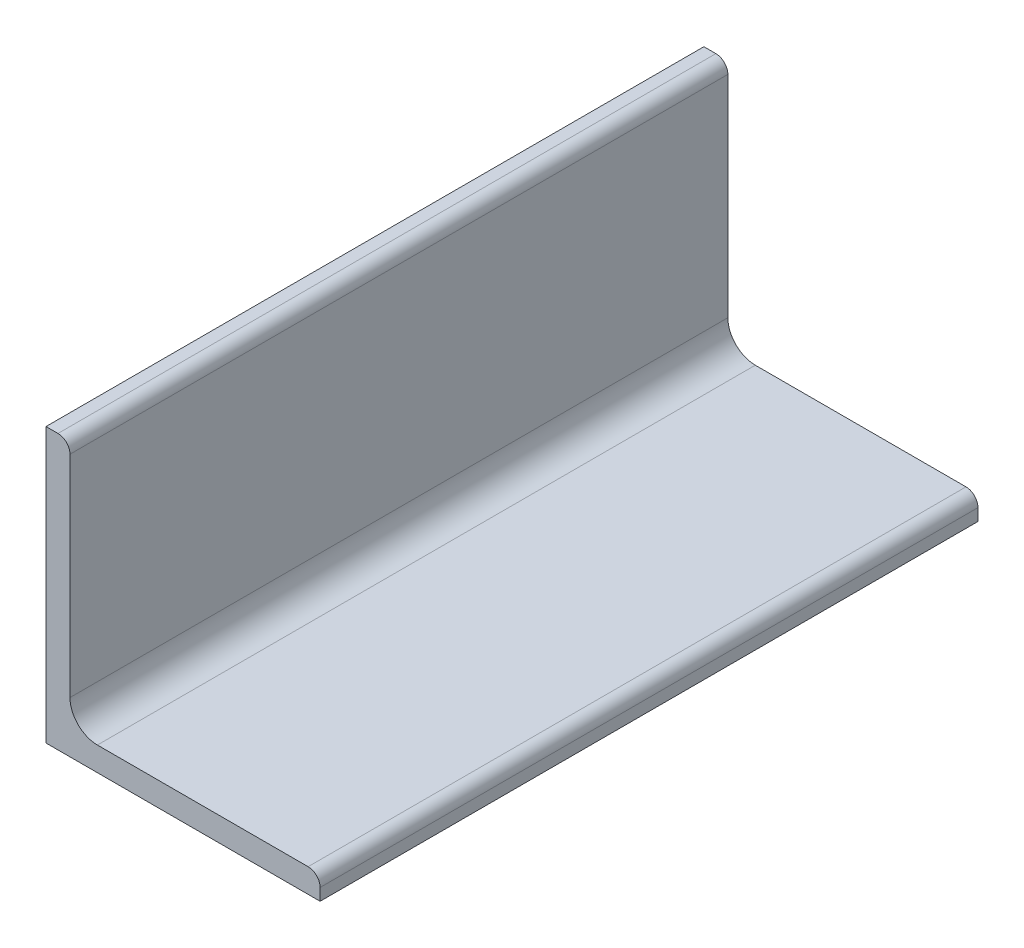
ISO-10303-21;
HEADER;
FILE_DESCRIPTION(('STEP AP214'),'2;1');
FILE_NAME('part.step','',(''),(''),'','','');
FILE_SCHEMA(('AUTOMOTIVE_DESIGN { 1 0 10303 214 1 1 1 1 }'));
ENDSEC;
DATA;
#1=APPLICATION_CONTEXT('core data for automotive mechanical design processes');
#2=APPLICATION_PROTOCOL_DEFINITION('international standard','automotive_design',2000,#1);
#3=PRODUCT_CONTEXT('',#1,'mechanical');
#4=PRODUCT('Part','Part','',(#3));
#5=PRODUCT_RELATED_PRODUCT_CATEGORY('part','',(#4));
#6=PRODUCT_DEFINITION_FORMATION('','',#4);
#7=PRODUCT_DEFINITION_CONTEXT('part definition',#1,'design');
#8=PRODUCT_DEFINITION('design','',#6,#7);
#9=PRODUCT_DEFINITION_SHAPE('','',#8);
#10=(LENGTH_UNIT() NAMED_UNIT(*) SI_UNIT(.MILLI.,.METRE.));
#11=(NAMED_UNIT(*) PLANE_ANGLE_UNIT() SI_UNIT($,.RADIAN.));
#12=(NAMED_UNIT(*) SI_UNIT($,.STERADIAN.) SOLID_ANGLE_UNIT());
#13=UNCERTAINTY_MEASURE_WITH_UNIT(LENGTH_MEASURE(1.E-05),#10,'distance_accuracy_value','');
#14=(GEOMETRIC_REPRESENTATION_CONTEXT(3) GLOBAL_UNCERTAINTY_ASSIGNED_CONTEXT((#13)) GLOBAL_UNIT_ASSIGNED_CONTEXT((#10,
#11,#12)) REPRESENTATION_CONTEXT('',''));
#15=CARTESIAN_POINT('',(0.,0.,0.));
#16=DIRECTION('',(0.,0.,1.));
#17=DIRECTION('',(1.,0.,0.));
#18=AXIS2_PLACEMENT_3D('',#15,#16,#17);
#19=CARTESIAN_POINT('',(0.0507450451214936,127.041655270204,304.8));
#20=DIRECTION('',(1.,0.,0.));
#21=DIRECTION('',(0.,0.,-1.));
#22=AXIS2_PLACEMENT_3D('',#19,#20,#21);
#23=PLANE('',#22);
#24=DIRECTION('',(0.,-1.,0.));
#25=VECTOR('',#24,1.);
#26=CARTESIAN_POINT('',(0.0507450451214936,127.041655270204,0.));
#27=LINE('',#26,#25);
#28=CARTESIAN_POINT('',(0.0507450451214936,127.041655270204,0.));
#29=VERTEX_POINT('',#28);
#30=CARTESIAN_POINT('',(0.0507450451214936,0.0416552702040917,0.));
#31=VERTEX_POINT('',#30);
#32=EDGE_CURVE('E135',#29,#31,#27,.T.);
#33=ORIENTED_EDGE('',*,*,#32,.T.);
#34=DIRECTION('',(0.,0.,-1.));
#35=VECTOR('',#34,1.);
#36=CARTESIAN_POINT('',(0.0507450451214936,0.0416552702040917,304.8));
#37=LINE('',#36,#35);
#38=CARTESIAN_POINT('',(0.0507450451214936,0.0416552702040917,304.8));
#39=VERTEX_POINT('',#38);
#40=EDGE_CURVE('E11',#39,#31,#37,.T.);
#41=ORIENTED_EDGE('',*,*,#40,.F.);
#42=DIRECTION('',(0.,-1.,0.));
#43=VECTOR('',#42,1.);
#44=CARTESIAN_POINT('',(0.0507450451214936,127.041655270204,304.8));
#45=LINE('',#44,#43);
#46=CARTESIAN_POINT('',(0.0507450451214936,127.041655270204,304.8));
#47=VERTEX_POINT('',#46);
#48=EDGE_CURVE('E151',#47,#39,#45,.T.);
#49=ORIENTED_EDGE('',*,*,#48,.F.);
#50=DIRECTION('',(0.,0.,-1.));
#51=VECTOR('',#50,1.);
#52=CARTESIAN_POINT('',(0.0507450451214936,127.041655270204,304.8));
#53=LINE('',#52,#51);
#54=EDGE_CURVE('E131',#47,#29,#53,.T.);
#55=ORIENTED_EDGE('',*,*,#54,.T.);
#56=EDGE_LOOP('',(#33,#41,#49,#55));
#57=FACE_BOUND('',#56,.T.);
#58=ADVANCED_FACE('F33',(#57),#23,.F.);
#59=CARTESIAN_POINT('',(0.0507450451214936,0.0416552702040917,304.8));
#60=DIRECTION('',(0.,1.,0.));
#61=DIRECTION('',(0.,0.,1.));
#62=AXIS2_PLACEMENT_3D('',#59,#60,#61);
#63=PLANE('',#62);
#64=DIRECTION('',(1.,0.,0.));
#65=VECTOR('',#64,1.);
#66=CARTESIAN_POINT('',(0.0507450451214936,0.0416552702040917,0.));
#67=LINE('',#66,#65);
#68=CARTESIAN_POINT('',(127.050745045121,0.0416552702040917,0.));
#69=VERTEX_POINT('',#68);
#70=EDGE_CURVE('E138',#31,#69,#67,.T.);
#71=ORIENTED_EDGE('',*,*,#70,.T.);
#72=DIRECTION('',(0.,0.,-1.));
#73=VECTOR('',#72,1.);
#74=CARTESIAN_POINT('',(127.050745045121,0.0416552702040917,304.8));
#75=LINE('',#74,#73);
#76=CARTESIAN_POINT('',(127.050745045121,0.0416552702040917,304.8));
#77=VERTEX_POINT('',#76);
#78=EDGE_CURVE('E41',#77,#69,#75,.T.);
#79=ORIENTED_EDGE('',*,*,#78,.F.);
#80=DIRECTION('',(1.,0.,0.));
#81=VECTOR('',#80,1.);
#82=CARTESIAN_POINT('',(0.0507450451214936,0.0416552702040917,304.8));
#83=LINE('',#82,#81);
#84=EDGE_CURVE('E95',#39,#77,#83,.T.);
#85=ORIENTED_EDGE('',*,*,#84,.F.);
#86=ORIENTED_EDGE('',*,*,#40,.T.);
#87=EDGE_LOOP('',(#71,#79,#85,#86));
#88=FACE_BOUND('',#87,.T.);
#89=ADVANCED_FACE('F194',(#88),#63,.F.);
#90=CARTESIAN_POINT('',(127.050745045121,0.0416552702040917,304.8));
#91=DIRECTION('',(-1.,0.,0.));
#92=DIRECTION('',(0.,0.,1.));
#93=AXIS2_PLACEMENT_3D('',#90,#91,#92);
#94=PLANE('',#93);
#95=DIRECTION('',(0.,1.,0.));
#96=VECTOR('',#95,1.);
#97=CARTESIAN_POINT('',(127.050745045121,0.0416552702040917,0.));
#98=LINE('',#97,#96);
#99=CARTESIAN_POINT('',(127.050745045121,5.59790527020409,0.));
#100=VERTEX_POINT('',#99);
#101=EDGE_CURVE('E140',#69,#100,#98,.T.);
#102=ORIENTED_EDGE('',*,*,#101,.T.);
#103=DIRECTION('',(0.,0.,-1.));
#104=VECTOR('',#103,1.);
#105=CARTESIAN_POINT('',(127.050745045121,5.59790527020409,304.8));
#106=LINE('',#105,#104);
#107=CARTESIAN_POINT('',(127.050745045121,5.59790527020409,304.8));
#108=VERTEX_POINT('',#107);
#109=EDGE_CURVE('E161',#108,#100,#106,.T.);
#110=ORIENTED_EDGE('',*,*,#109,.F.);
#111=DIRECTION('',(0.,1.,0.));
#112=VECTOR('',#111,1.);
#113=CARTESIAN_POINT('',(127.050745045121,0.0416552702040917,304.8));
#114=LINE('',#113,#112);
#115=EDGE_CURVE('E169',#77,#108,#114,.T.);
#116=ORIENTED_EDGE('',*,*,#115,.F.);
#117=ORIENTED_EDGE('',*,*,#78,.T.);
#118=EDGE_LOOP('',(#102,#110,#116,#117));
#119=FACE_BOUND('',#118,.T.);
#120=ADVANCED_FACE('F167',(#119),#94,.F.);
#121=CARTESIAN_POINT('',(121.494495045121,5.59790527020409,304.8));
#122=DIRECTION('',(0.,0.,-1.));
#123=DIRECTION('',(-1.,0.,0.));
#124=AXIS2_PLACEMENT_3D('',#121,#122,#123);
#125=CYLINDRICAL_SURFACE('',#124,5.55625);
#126=CARTESIAN_POINT('',(121.494495045121,5.59790527020409,0.));
#127=DIRECTION('',(0.,0.,1.));
#128=DIRECTION('',(1.,0.,0.));
#129=AXIS2_PLACEMENT_3D('',#126,#127,#128);
#130=CIRCLE('',#129,5.55625);
#131=CARTESIAN_POINT('',(121.494495045121,11.1541552702041,0.));
#132=VERTEX_POINT('',#131);
#133=EDGE_CURVE('E142',#100,#132,#130,.T.);
#134=ORIENTED_EDGE('',*,*,#133,.T.);
#135=DIRECTION('',(0.,0.,-1.));
#136=VECTOR('',#135,1.);
#137=CARTESIAN_POINT('',(121.494495045121,11.1541552702041,304.8));
#138=LINE('',#137,#136);
#139=CARTESIAN_POINT('',(121.494495045121,11.1541552702041,304.8));
#140=VERTEX_POINT('',#139);
#141=EDGE_CURVE('E158',#140,#132,#138,.T.);
#142=ORIENTED_EDGE('',*,*,#141,.F.);
#143=CARTESIAN_POINT('',(121.494495045121,5.59790527020409,304.8));
#144=DIRECTION('',(0.,0.,1.));
#145=DIRECTION('',(1.,0.,0.));
#146=AXIS2_PLACEMENT_3D('',#143,#144,#145);
#147=CIRCLE('',#146,5.55625);
#148=EDGE_CURVE('E185',#108,#140,#147,.T.);
#149=ORIENTED_EDGE('',*,*,#148,.F.);
#150=ORIENTED_EDGE('',*,*,#109,.T.);
#151=EDGE_LOOP('',(#134,#142,#149,#150));
#152=FACE_BOUND('',#151,.T.);
#153=ADVANCED_FACE('F178',(#152),#125,.T.);
#154=CARTESIAN_POINT('',(121.494495045121,11.1541552702041,304.8));
#155=DIRECTION('',(0.,-1.,0.));
#156=DIRECTION('',(0.,0.,-1.));
#157=AXIS2_PLACEMENT_3D('',#154,#155,#156);
#158=PLANE('',#157);
#159=DIRECTION('',(-1.,0.,0.));
#160=VECTOR('',#159,1.);
#161=CARTESIAN_POINT('',(121.494495045121,11.1541552702041,0.));
#162=LINE('',#161,#160);
#163=CARTESIAN_POINT('',(23.8632450451215,11.1541552702041,0.));
#164=VERTEX_POINT('',#163);
#165=EDGE_CURVE('E144',#132,#164,#162,.T.);
#166=ORIENTED_EDGE('',*,*,#165,.T.);
#167=DIRECTION('',(0.,0.,-1.));
#168=VECTOR('',#167,1.);
#169=CARTESIAN_POINT('',(23.8632450451215,11.1541552702041,304.8));
#170=LINE('',#169,#168);
#171=CARTESIAN_POINT('',(23.8632450451215,11.1541552702041,304.8));
#172=VERTEX_POINT('',#171);
#173=EDGE_CURVE('E155',#172,#164,#170,.T.);
#174=ORIENTED_EDGE('',*,*,#173,.F.);
#175=DIRECTION('',(-1.,0.,0.));
#176=VECTOR('',#175,1.);
#177=CARTESIAN_POINT('',(121.494495045121,11.1541552702041,304.8));
#178=LINE('',#177,#176);
#179=EDGE_CURVE('E184',#140,#172,#178,.T.);
#180=ORIENTED_EDGE('',*,*,#179,.F.);
#181=ORIENTED_EDGE('',*,*,#141,.T.);
#182=EDGE_LOOP('',(#166,#174,#180,#181));
#183=FACE_BOUND('',#182,.T.);
#184=ADVANCED_FACE('F182',(#183),#158,.F.);
#185=CARTESIAN_POINT('',(23.8632450451215,23.8541552702041,304.8));
#186=DIRECTION('',(0.,0.,-1.));
#187=DIRECTION('',(-1.,0.,0.));
#188=AXIS2_PLACEMENT_3D('',#185,#186,#187);
#189=CYLINDRICAL_SURFACE('',#188,12.7);
#190=CARTESIAN_POINT('',(23.8632450451215,23.8541552702041,0.));
#191=DIRECTION('',(0.,0.,-1.));
#192=DIRECTION('',(1.,0.,0.));
#193=AXIS2_PLACEMENT_3D('',#190,#191,#192);
#194=CIRCLE('',#193,12.7);
#195=CARTESIAN_POINT('',(11.1632450451215,23.8541552702041,0.));
#196=VERTEX_POINT('',#195);
#197=EDGE_CURVE('E146',#164,#196,#194,.T.);
#198=ORIENTED_EDGE('',*,*,#197,.T.);
#199=DIRECTION('',(0.,0.,-1.));
#200=VECTOR('',#199,1.);
#201=CARTESIAN_POINT('',(11.1632450451215,23.8541552702041,304.8));
#202=LINE('',#201,#200);
#203=CARTESIAN_POINT('',(11.1632450451215,23.8541552702041,304.8));
#204=VERTEX_POINT('',#203);
#205=EDGE_CURVE('E126',#204,#196,#202,.T.);
#206=ORIENTED_EDGE('',*,*,#205,.F.);
#207=CARTESIAN_POINT('',(23.8632450451215,23.8541552702041,304.8));
#208=DIRECTION('',(0.,0.,-1.));
#209=DIRECTION('',(1.,0.,0.));
#210=AXIS2_PLACEMENT_3D('',#207,#208,#209);
#211=CIRCLE('',#210,12.7);
#212=EDGE_CURVE('E117',#172,#204,#211,.T.);
#213=ORIENTED_EDGE('',*,*,#212,.F.);
#214=ORIENTED_EDGE('',*,*,#173,.T.);
#215=EDGE_LOOP('',(#198,#206,#213,#214));
#216=FACE_BOUND('',#215,.T.);
#217=ADVANCED_FACE('F206',(#216),#189,.F.);
#218=CARTESIAN_POINT('',(11.1632450451215,23.8541552702041,304.8));
#219=DIRECTION('',(-1.,0.,0.));
#220=DIRECTION('',(0.,0.,1.));
#221=AXIS2_PLACEMENT_3D('',#218,#219,#220);
#222=PLANE('',#221);
#223=DIRECTION('',(0.,1.,0.));
#224=VECTOR('',#223,1.);
#225=CARTESIAN_POINT('',(11.1632450451215,23.8541552702041,0.));
#226=LINE('',#225,#224);
#227=CARTESIAN_POINT('',(11.1632450451215,121.485405270204,0.));
#228=VERTEX_POINT('',#227);
#229=EDGE_CURVE('E125',#196,#228,#226,.T.);
#230=ORIENTED_EDGE('',*,*,#229,.T.);
#231=DIRECTION('',(0.,0.,-1.));
#232=VECTOR('',#231,1.);
#233=CARTESIAN_POINT('',(11.1632450451215,121.485405270204,304.8));
#234=LINE('',#233,#232);
#235=CARTESIAN_POINT('',(11.1632450451215,121.485405270204,304.8));
#236=VERTEX_POINT('',#235);
#237=EDGE_CURVE('E122',#236,#228,#234,.T.);
#238=ORIENTED_EDGE('',*,*,#237,.F.);
#239=DIRECTION('',(0.,1.,0.));
#240=VECTOR('',#239,1.);
#241=CARTESIAN_POINT('',(11.1632450451215,23.8541552702041,304.8));
#242=LINE('',#241,#240);
#243=EDGE_CURVE('E111',#204,#236,#242,.T.);
#244=ORIENTED_EDGE('',*,*,#243,.F.);
#245=ORIENTED_EDGE('',*,*,#205,.T.);
#246=EDGE_LOOP('',(#230,#238,#244,#245));
#247=FACE_BOUND('',#246,.T.);
#248=ADVANCED_FACE('F123',(#247),#222,.F.);
#249=CARTESIAN_POINT('',(5.6069950451215,121.485405270204,304.8));
#250=DIRECTION('',(0.,0.,-1.));
#251=DIRECTION('',(-1.,0.,0.));
#252=AXIS2_PLACEMENT_3D('',#249,#250,#251);
#253=CYLINDRICAL_SURFACE('',#252,5.55625);
#254=CARTESIAN_POINT('',(5.6069950451215,121.485405270204,0.));
#255=DIRECTION('',(0.,0.,1.));
#256=DIRECTION('',(1.,0.,0.));
#257=AXIS2_PLACEMENT_3D('',#254,#255,#256);
#258=CIRCLE('',#257,5.55625);
#259=CARTESIAN_POINT('',(5.60699504512149,127.041655270204,0.));
#260=VERTEX_POINT('',#259);
#261=EDGE_CURVE('E81',#228,#260,#258,.T.);
#262=ORIENTED_EDGE('',*,*,#261,.T.);
#263=DIRECTION('',(0.,0.,-1.));
#264=VECTOR('',#263,1.);
#265=CARTESIAN_POINT('',(5.60699504512149,127.041655270204,304.8));
#266=LINE('',#265,#264);
#267=CARTESIAN_POINT('',(5.60699504512149,127.041655270204,304.8));
#268=VERTEX_POINT('',#267);
#269=EDGE_CURVE('E127',#268,#260,#266,.T.);
#270=ORIENTED_EDGE('',*,*,#269,.F.);
#271=CARTESIAN_POINT('',(5.6069950451215,121.485405270204,304.8));
#272=DIRECTION('',(0.,0.,1.));
#273=DIRECTION('',(1.,0.,0.));
#274=AXIS2_PLACEMENT_3D('',#271,#272,#273);
#275=CIRCLE('',#274,5.55625);
#276=EDGE_CURVE('E115',#236,#268,#275,.T.);
#277=ORIENTED_EDGE('',*,*,#276,.F.);
#278=ORIENTED_EDGE('',*,*,#237,.T.);
#279=EDGE_LOOP('',(#262,#270,#277,#278));
#280=FACE_BOUND('',#279,.T.);
#281=ADVANCED_FACE('F129',(#280),#253,.T.);
#282=CARTESIAN_POINT('',(5.60699504512149,127.041655270204,304.8));
#283=DIRECTION('',(0.,-1.,0.));
#284=DIRECTION('',(0.,0.,-1.));
#285=AXIS2_PLACEMENT_3D('',#282,#283,#284);
#286=PLANE('',#285);
#287=DIRECTION('',(-1.,0.,0.));
#288=VECTOR('',#287,1.);
#289=CARTESIAN_POINT('',(5.60699504512149,127.041655270204,0.));
#290=LINE('',#289,#288);
#291=EDGE_CURVE('E87',#260,#29,#290,.T.);
#292=ORIENTED_EDGE('',*,*,#291,.T.);
#293=ORIENTED_EDGE('',*,*,#54,.F.);
#294=DIRECTION('',(-1.,0.,0.));
#295=VECTOR('',#294,1.);
#296=CARTESIAN_POINT('',(5.60699504512149,127.041655270204,304.8));
#297=LINE('',#296,#295);
#298=EDGE_CURVE('E49',#268,#47,#297,.T.);
#299=ORIENTED_EDGE('',*,*,#298,.F.);
#300=ORIENTED_EDGE('',*,*,#269,.T.);
#301=EDGE_LOOP('',(#292,#293,#299,#300));
#302=FACE_BOUND('',#301,.T.);
#303=ADVANCED_FACE('F214',(#302),#286,.F.);
#304=CARTESIAN_POINT('',(121.494495045121,5.59790527020409,304.8));
#305=DIRECTION('',(0.,0.,1.));
#306=DIRECTION('',(1.,0.,0.));
#307=AXIS2_PLACEMENT_3D('',#304,#305,#306);
#308=PLANE('',#307);
#309=ORIENTED_EDGE('',*,*,#48,.T.);
#310=ORIENTED_EDGE('',*,*,#84,.T.);
#311=ORIENTED_EDGE('',*,*,#115,.T.);
#312=ORIENTED_EDGE('',*,*,#148,.T.);
#313=ORIENTED_EDGE('',*,*,#179,.T.);
#314=ORIENTED_EDGE('',*,*,#212,.T.);
#315=ORIENTED_EDGE('',*,*,#243,.T.);
#316=ORIENTED_EDGE('',*,*,#276,.T.);
#317=ORIENTED_EDGE('',*,*,#298,.T.);
#318=EDGE_LOOP('',(#309,#310,#311,#312,#313,#314,#315,#316,#317));
#319=FACE_BOUND('',#318,.T.);
#320=ADVANCED_FACE('F113',(#319),#308,.T.);
#321=CARTESIAN_POINT('',(121.494495045121,5.59790527020409,0.));
#322=DIRECTION('',(0.,0.,1.));
#323=DIRECTION('',(1.,0.,0.));
#324=AXIS2_PLACEMENT_3D('',#321,#322,#323);
#325=PLANE('',#324);
#326=ORIENTED_EDGE('',*,*,#32,.F.);
#327=ORIENTED_EDGE('',*,*,#291,.F.);
#328=ORIENTED_EDGE('',*,*,#261,.F.);
#329=ORIENTED_EDGE('',*,*,#229,.F.);
#330=ORIENTED_EDGE('',*,*,#197,.F.);
#331=ORIENTED_EDGE('',*,*,#165,.F.);
#332=ORIENTED_EDGE('',*,*,#133,.F.);
#333=ORIENTED_EDGE('',*,*,#101,.F.);
#334=ORIENTED_EDGE('',*,*,#70,.F.);
#335=EDGE_LOOP('',(#326,#327,#328,#329,#330,#331,#332,#333,#334));
#336=FACE_BOUND('',#335,.T.);
#337=ADVANCED_FACE('F173',(#336),#325,.F.);
#338=CLOSED_SHELL('',(#58,#89,#120,#153,#184,#217,#248,#281,#303,#320,#337));
#339=MANIFOLD_SOLID_BREP('B2',#338);
#340=ADVANCED_BREP_SHAPE_REPRESENTATION('',(#18,#339),#14);
#341=SHAPE_DEFINITION_REPRESENTATION(#9,#340);
ENDSEC;
END-ISO-10303-21;
